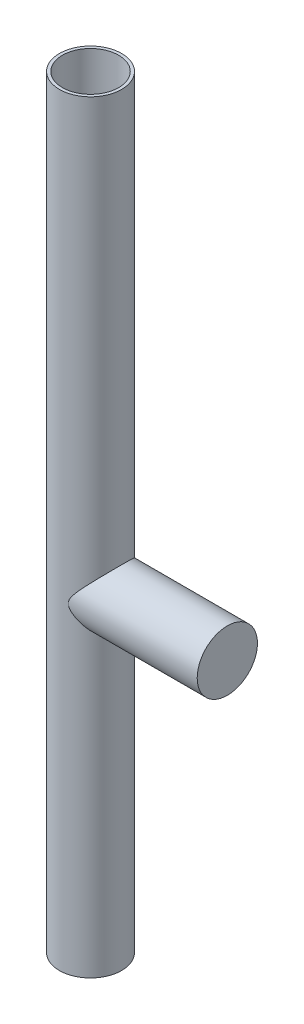
ISO-10303-21;
HEADER;
FILE_DESCRIPTION(('STEP AP214'),'2;1');
FILE_NAME('part.step','',(''),(''),'','','');
FILE_SCHEMA(('AUTOMOTIVE_DESIGN { 1 0 10303 214 1 1 1 1 }'));
ENDSEC;
DATA;
#1=APPLICATION_CONTEXT('core data for automotive mechanical design processes');
#2=APPLICATION_PROTOCOL_DEFINITION('international standard','automotive_design',2000,#1);
#3=PRODUCT_CONTEXT('',#1,'mechanical');
#4=PRODUCT('Part','Part','',(#3));
#5=PRODUCT_RELATED_PRODUCT_CATEGORY('part','',(#4));
#6=PRODUCT_DEFINITION_FORMATION('','',#4);
#7=PRODUCT_DEFINITION_CONTEXT('part definition',#1,'design');
#8=PRODUCT_DEFINITION('design','',#6,#7);
#9=PRODUCT_DEFINITION_SHAPE('','',#8);
#10=(LENGTH_UNIT() NAMED_UNIT(*) SI_UNIT(.MILLI.,.METRE.));
#11=(NAMED_UNIT(*) PLANE_ANGLE_UNIT() SI_UNIT($,.RADIAN.));
#12=(NAMED_UNIT(*) SI_UNIT($,.STERADIAN.) SOLID_ANGLE_UNIT());
#13=UNCERTAINTY_MEASURE_WITH_UNIT(LENGTH_MEASURE(1.E-05),#10,'distance_accuracy_value','');
#14=(GEOMETRIC_REPRESENTATION_CONTEXT(3) GLOBAL_UNCERTAINTY_ASSIGNED_CONTEXT((#13)) GLOBAL_UNIT_ASSIGNED_CONTEXT((#10,
#11,#12)) REPRESENTATION_CONTEXT('',''));
#15=CARTESIAN_POINT('',(0.,0.,0.));
#16=DIRECTION('',(0.,0.,1.));
#17=DIRECTION('',(1.,0.,0.));
#18=AXIS2_PLACEMENT_3D('',#15,#16,#17);
#19=CARTESIAN_POINT('',(72.0622031998294,75.,0.));
#20=DIRECTION('',(-1.,0.,0.));
#21=DIRECTION('',(0.,0.,1.));
#22=AXIS2_PLACEMENT_3D('',#19,#20,#21);
#23=CYLINDRICAL_SURFACE('',#22,7.5);
#24=CARTESIAN_POINT('',(1.95256241897666,75.,7.5));
#25=CARTESIAN_POINT('',(1.95254027287941,75.1301890502717,7.50000356990272));
#26=CARTESIAN_POINT('',(1.96590520223219,75.2603568940081,7.49656241617327));
#27=CARTESIAN_POINT('',(2.01569819316504,75.5162819695374,7.48331854549107));
#28=CARTESIAN_POINT('',(2.05225463976761,75.6420105092941,7.47348040811489));
#29=CARTESIAN_POINT('',(2.13363712639972,75.865327485485,7.45060684486488));
#30=CARTESIAN_POINT('',(2.17590108832877,75.9639934948249,7.43843077396391));
#31=CARTESIAN_POINT('',(2.2681474237054,76.1572248140775,7.4108262060249));
#32=CARTESIAN_POINT('',(2.31813693956844,76.2517862245286,7.39539469440364));
#33=CARTESIAN_POINT('',(2.47617651022723,76.5305882452537,7.34460192400622));
#34=CARTESIAN_POINT('',(2.59210402189804,76.709487952865,7.30479296654339));
#35=CARTESIAN_POINT('',(2.85729149296307,77.0913591856681,7.20571259971662));
#36=CARTESIAN_POINT('',(3.00864163713575,77.2922162919602,7.14415925232692));
#37=CARTESIAN_POINT('',(3.3171934453091,77.6843476964629,7.00624041361422));
#38=CARTESIAN_POINT('',(3.47440032136982,77.8756130856665,6.92986146123077));
#39=CARTESIAN_POINT('',(3.79048844505221,78.2504467138194,6.76215779582004));
#40=CARTESIAN_POINT('',(3.94937144041231,78.4340056608059,6.67081565643868));
#41=CARTESIAN_POINT('',(4.26590173295146,78.7937680865314,6.47297704973329));
#42=CARTESIAN_POINT('',(4.42354936760267,78.969973635296,6.36648488496098));
#43=CARTESIAN_POINT('',(4.77008079089776,79.3530728523875,6.11265712391416));
#44=CARTESIAN_POINT('',(4.95818344072453,79.5581613734927,5.96149384180011));
#45=CARTESIAN_POINT('',(5.32639528655411,79.9561730500059,5.63494701276092));
#46=CARTESIAN_POINT('',(5.5065008896944,80.1490907534428,5.45955272210076));
#47=CARTESIAN_POINT('',(5.8547129489229,80.5198913908207,5.08429956510327));
#48=CARTESIAN_POINT('',(6.02285659504625,80.6978212711934,4.88452228632779));
#49=CARTESIAN_POINT('',(6.34382195995667,81.0360927605903,4.45974127182885));
#50=CARTESIAN_POINT('',(6.49665810123219,81.1964509390558,4.23476171295629));
#51=CARTESIAN_POINT('',(6.80364239113859,81.5176370856967,3.72473278881411));
#52=CARTESIAN_POINT('',(6.95478060459687,81.6751757748202,3.43570192792498));
#53=CARTESIAN_POINT('',(7.15644612432528,81.8849534856609,2.97918511429341));
#54=CARTESIAN_POINT('',(7.21950433346244,81.9504680102473,2.82315125802899));
#55=CARTESIAN_POINT('',(7.33630454717285,82.071713423744,2.50398942637429));
#56=CARTESIAN_POINT('',(7.3900510089274,82.1274489936331,2.34086489205796));
#57=CARTESIAN_POINT('',(7.48772711238075,82.2286745024491,2.00674606041653));
#58=CARTESIAN_POINT('',(7.53155773015203,82.2740611249008,1.83569132156844));
#59=CARTESIAN_POINT('',(7.6078174013041,82.3529918718908,1.48836051755561));
#60=CARTESIAN_POINT('',(7.64024647712757,82.3865360197397,1.3120844626692));
#61=CARTESIAN_POINT('',(7.69292481367634,82.4410107036105,0.955923074061227));
#62=CARTESIAN_POINT('',(7.7131830076892,82.4619504911098,0.77604048795549));
#63=CARTESIAN_POINT('',(7.74104528569166,82.490747330483,0.414265296344475));
#64=CARTESIAN_POINT('',(7.74865113994895,82.4986062125879,0.232372975619271));
#65=CARTESIAN_POINT('',(7.75086572435814,82.500894551507,-0.107713351385544));
#66=CARTESIAN_POINT('',(7.7470465594858,82.4969484027336,-0.265890370151748));
#67=CARTESIAN_POINT('',(7.72979138508297,82.4791162593342,-0.581155813814566));
#68=CARTESIAN_POINT('',(7.71635553573556,82.4652304302714,-0.738244256799352));
#69=CARTESIAN_POINT('',(7.6801250963743,82.4277751714667,-1.05015842492861));
#70=CARTESIAN_POINT('',(7.65733066802929,82.4042059090055,-1.20498418911287));
#71=CARTESIAN_POINT('',(7.60280151254774,82.347798502893,-1.51133056285157));
#72=CARTESIAN_POINT('',(7.57106646918115,82.3149600313892,-1.66285105529409));
#73=CARTESIAN_POINT('',(7.4999180044693,82.2412954292593,-1.95867303867399));
#74=CARTESIAN_POINT('',(7.46067229268881,82.2006436923805,-2.10305848479811));
#75=CARTESIAN_POINT('',(7.37470118482368,82.1115296651748,-2.38711899506823));
#76=CARTESIAN_POINT('',(7.32797365392898,82.0630651455759,-2.52679270098651));
#77=CARTESIAN_POINT('',(7.17748500075082,81.9068501535315,-2.9378934273682));
#78=CARTESIAN_POINT('',(7.06337770699466,81.7882367916999,-3.20156266232297));
#79=CARTESIAN_POINT('',(6.84637738953641,81.5620960088776,-3.6376074580444));
#80=CARTESIAN_POINT('',(6.74863418835963,81.4600743884691,-3.81555231105567));
#81=CARTESIAN_POINT('',(6.5429539975206,81.2448977289165,-4.15838545438968));
#82=CARTESIAN_POINT('',(6.43501588370935,81.1317414619453,-4.32327230116854));
#83=CARTESIAN_POINT('',(6.21036735788039,80.8955490620631,-4.64022495347486));
#84=CARTESIAN_POINT('',(6.09363518929716,80.7724883705079,-4.79225684512036));
#85=CARTESIAN_POINT('',(5.85316182217974,80.5180368091598,-5.08316928074444));
#86=CARTESIAN_POINT('',(5.72942075057901,80.386646090221,-5.22205006277217));
#87=CARTESIAN_POINT('',(5.43005788870909,80.0672657820773,-5.53529654472826));
#88=CARTESIAN_POINT('',(5.25198337696498,79.8761204328712,-5.70411469850548));
#89=CARTESIAN_POINT('',(4.88838841507936,79.4821454384826,-6.01863497610819));
#90=CARTESIAN_POINT('',(4.70286412060642,79.2793097365728,-6.164324967878));
#91=CARTESIAN_POINT('',(4.32780783607666,78.8633578794395,-6.43317336208854));
#92=CARTESIAN_POINT('',(4.13828151045811,78.6502557705075,-6.55636150349144));
#93=CARTESIAN_POINT('',(3.75872251288581,78.2136113870479,-6.78107931429117));
#94=CARTESIAN_POINT('',(3.56869020835096,77.9900753859155,-6.88262179881014));
#95=CARTESIAN_POINT('',(3.23422142691717,77.5804176578913,-7.04477821649563));
#96=CARTESIAN_POINT('',(3.08883901014458,77.3967029966683,-7.1094921177642));
#97=CARTESIAN_POINT('',(2.87670542265433,77.1134788910826,-7.19673195269228));
#98=CARTESIAN_POINT('',(2.80694578179858,77.0177381712533,-7.22418636545723));
#99=CARTESIAN_POINT('',(2.67053132359378,76.8231934127341,-7.27571861977974));
#100=CARTESIAN_POINT('',(2.60387604686119,76.7243898309137,-7.29979696199499));
#101=CARTESIAN_POINT('',(2.44170603015909,76.4708645470277,-7.35603077462036));
#102=CARTESIAN_POINT('',(2.34914032570697,76.3137036848471,-7.38590393395599));
#103=CARTESIAN_POINT('',(2.18375261076396,75.987843446622,-7.43647380921712));
#104=CARTESIAN_POINT('',(2.11085988094345,75.8191882054588,-7.45720356858238));
#105=CARTESIAN_POINT('',(2.02171618008148,75.5343924563744,-7.4817448089777));
#106=CARTESIAN_POINT('',(1.99447925788354,75.4221309836867,-7.48898274066381));
#107=CARTESIAN_POINT('',(1.95903966691131,75.1945637818613,-7.49833482995199));
#108=CARTESIAN_POINT('',(1.95078343428337,75.0792675505072,-7.50046340699817));
#109=CARTESIAN_POINT('',(1.95500219863361,74.8488888492252,-7.49936454467398));
#110=CARTESIAN_POINT('',(1.96751716142526,74.7338072189072,-7.49612677995322));
#111=CARTESIAN_POINT('',(2.01067644785891,74.5072296445273,-7.48466009422864));
#112=CARTESIAN_POINT('',(2.04137116110638,74.3957445783591,-7.47641729895754));
#113=CARTESIAN_POINT('',(2.11124425163456,74.192030006266,-7.45696184233885));
#114=CARTESIAN_POINT('',(2.14881562505552,74.0991728124093,-7.44627002769129));
#115=CARTESIAN_POINT('',(2.23126745170366,73.9171115507853,-7.42198045069847));
#116=CARTESIAN_POINT('',(2.27615471921823,73.8279109868178,-7.40837997539909));
#117=CARTESIAN_POINT('',(2.37129101172992,73.6524160318184,-7.37848068654962));
#118=CARTESIAN_POINT('',(2.42156263489764,73.5661360623893,-7.36217032827195));
#119=CARTESIAN_POINT('',(2.5257751687595,73.3964058989416,-7.32707228926546));
#120=CARTESIAN_POINT('',(2.57971490246393,73.3129548099765,-7.30828540138392));
#121=CARTESIAN_POINT('',(2.71840224747815,73.1063971949827,-7.25814312053561));
#122=CARTESIAN_POINT('',(2.80482384387862,72.9847876231463,-7.22526652273103));
#123=CARTESIAN_POINT('',(2.98123783204384,72.7457264959351,-7.15428459342945));
#124=CARTESIAN_POINT('',(3.07123161782724,72.6282765983539,-7.1161772061114));
#125=CARTESIAN_POINT('',(3.25340740517797,72.3966798065256,-7.03475708264581));
#126=CARTESIAN_POINT('',(3.34559201782877,72.2825372546658,-6.99143785657831));
#127=CARTESIAN_POINT('',(3.53104345280444,72.0572405424322,-6.89963426250104));
#128=CARTESIAN_POINT('',(3.62431040768229,71.9460867537373,-6.85114925576766));
#129=CARTESIAN_POINT('',(3.90469664444104,71.6165678565567,-6.69784878168772));
#130=CARTESIAN_POINT('',(4.0923402536245,71.4022210232242,-6.58521463103373));
#131=CARTESIAN_POINT('',(4.46468347287635,70.9838013499097,-6.33869131205799));
#132=CARTESIAN_POINT('',(4.64938534354837,70.7797203320953,-6.20481942670768));
#133=CARTESIAN_POINT('',(4.98367927569591,70.4142527778987,-5.93830512381304));
#134=CARTESIAN_POINT('',(5.13413680618987,70.2512819918157,-5.80893408684942));
#135=CARTESIAN_POINT('',(5.42917193428811,69.9337553727086,-5.53419195861925));
#136=CARTESIAN_POINT('',(5.57374849376934,69.7792010237571,-5.38881805913076));
#137=CARTESIAN_POINT('',(5.99534743655019,69.3305888588968,-4.92858519858198));
#138=CARTESIAN_POINT('',(6.2612522124272,69.0504853290095,-4.58883251688156));
#139=CARTESIAN_POINT('',(6.68056512454135,68.6109114307562,-3.94191283325759));
#140=CARTESIAN_POINT('',(6.8450451348759,68.4392087911171,-3.65030961219098));
#141=CARTESIAN_POINT('',(7.06626080229294,68.2088291137177,-3.18743418734476));
#142=CARTESIAN_POINT('',(7.13574572732094,68.1365679404697,-3.02890605250445));
#143=CARTESIAN_POINT('',(7.26514755941465,68.0021288215223,-2.7038308639568));
#144=CARTESIAN_POINT('',(7.32506582139295,67.9399494479329,-2.53728495015218));
#145=CARTESIAN_POINT('',(7.42607041884569,67.8352122238539,-2.22240882282034));
#146=CARTESIAN_POINT('',(7.46863250494605,67.7911111671621,-2.0750632112109));
#147=CARTESIAN_POINT('',(7.54536227034881,67.7116463670265,-1.77590561385838));
#148=CARTESIAN_POINT('',(7.57953144814348,67.6762810638716,-1.62409443083812));
#149=CARTESIAN_POINT('',(7.63889095729658,67.6148651229367,-1.31692911782155));
#150=CARTESIAN_POINT('',(7.66408486499287,67.5888107750468,-1.16157642530945));
#151=CARTESIAN_POINT('',(7.70505181339951,67.5464536995863,-0.848308586543059));
#152=CARTESIAN_POINT('',(7.72082474811813,67.5301510817287,-0.6903934114798));
#153=CARTESIAN_POINT('',(7.74267536431238,67.5075684862173,-0.372698536172449));
#154=CARTESIAN_POINT('',(7.74872388511626,67.5013186538993,-0.212914669877019));
#155=CARTESIAN_POINT('',(7.75091283288039,67.4990567378023,0.106793936134085));
#156=CARTESIAN_POINT('',(7.7470532490232,67.5030446652005,0.266718676003372));
#157=CARTESIAN_POINT('',(7.72950286697246,67.5211819253413,0.585461348422942));
#158=CARTESIAN_POINT('',(7.71581102520552,67.5353323367069,0.744279161679741));
#159=CARTESIAN_POINT('',(7.67886574858892,67.5735269088175,1.05958530949372));
#160=CARTESIAN_POINT('',(7.65561238406324,67.5975709967957,1.21607366117507));
#161=CARTESIAN_POINT('',(7.60120639027559,67.6538521494461,1.51879920424658));
#162=CARTESIAN_POINT('',(7.57044825176574,67.6856801996299,1.66518380575865));
#163=CARTESIAN_POINT('',(7.50108421931344,67.7574969661752,1.95405768952563));
#164=CARTESIAN_POINT('',(7.46247536655688,67.7974887593488,2.09654548009397));
#165=CARTESIAN_POINT('',(7.33568823909152,67.9289067374357,2.517084366705));
#166=CARTESIAN_POINT('',(7.2365140742332,68.031811992587,2.78840196165883));
#167=CARTESIAN_POINT('',(7.04767030891197,68.2281728172955,3.2298441746521));
#168=CARTESIAN_POINT('',(6.96422111951203,68.3150490189622,3.40572684810952));
#169=CARTESIAN_POINT('',(6.7871010108309,68.4997752018249,3.74627564451735));
#170=CARTESIAN_POINT('',(6.69342684066661,68.5976286733591,3.91093817300184));
#171=CARTESIAN_POINT('',(6.39895314391098,68.9059159182756,4.38813382240221));
#172=CARTESIAN_POINT('',(6.18492207997442,69.1308489170234,4.68337854030551));
#173=CARTESIAN_POINT('',(5.80429472867883,69.5337220845628,5.14113393117714));
#174=CARTESIAN_POINT('',(5.64409298887496,69.7040384546007,5.31609945829633));
#175=CARTESIAN_POINT('',(5.31495938398476,70.0562921696452,5.64515827224314));
#176=CARTESIAN_POINT('',(5.14602359860733,70.2382347418915,5.79924207191395));
#177=CARTESIAN_POINT('',(4.80226359823655,70.611988315471,6.0869508369384));
#178=CARTESIAN_POINT('',(4.62744405222879,70.8037915529146,6.22059157844494));
#179=CARTESIAN_POINT('',(4.27447335653798,71.1965751083213,6.46821713069223));
#180=CARTESIAN_POINT('',(4.09632352718351,71.3975518330758,6.58220955541836));
#181=CARTESIAN_POINT('',(3.73491438100616,71.8143477918852,6.79395342805739));
#182=CARTESIAN_POINT('',(3.55164483015955,72.0304192761152,6.89119412185364));
#183=CARTESIAN_POINT('',(3.2802809454079,72.3633760397362,7.02227970135439));
#184=CARTESIAN_POINT('',(3.19036253278028,72.4759080204377,7.06353299924593));
#185=CARTESIAN_POINT('',(3.0127964347602,72.7044258960287,7.14107255141409));
#186=CARTESIAN_POINT('',(2.92514844291636,72.8204113201971,7.17735947889158));
#187=CARTESIAN_POINT('',(2.77048898723196,73.0334402954281,7.23825835964615));
#188=CARTESIAN_POINT('',(2.70280222510427,73.1297361663225,7.26376416720267));
#189=CARTESIAN_POINT('',(2.5711370244475,73.3256291305036,7.31140529448361));
#190=CARTESIAN_POINT('',(2.50715764099913,73.4252253723442,7.33354147540362));
#191=CARTESIAN_POINT('',(2.3847968889834,73.6283837653794,7.3742381293891));
#192=CARTESIAN_POINT('',(2.32640834468138,73.7319405875643,7.39280321763623));
#193=CARTESIAN_POINT('',(2.21801632314516,73.943883092654,7.42604304105235));
#194=CARTESIAN_POINT('',(2.16800416460252,74.0522636268904,7.44072181329136));
#195=CARTESIAN_POINT('',(2.07177383643325,74.296639772884,7.46814667247941));
#196=CARTESIAN_POINT('',(2.02824367384823,74.4338696270216,7.47994246052326));
#197=CARTESIAN_POINT('',(1.96874742834689,74.7141070116345,7.49583999418336));
#198=CARTESIAN_POINT('',(1.9525867330331,74.8570662866797,7.49999608062697));
#199=CARTESIAN_POINT('',(1.95256241897666,75.,7.5));
#200=B_SPLINE_CURVE_WITH_KNOTS('',3,(#24,#25,#26,#27,#28,#29,#30,#31,#32,#33,#34,#35,#36,#37,
#38,#39,#40,#41,#42,#43,#44,#45,#46,#47,#48,#49,#50,#51,#52,#53,#54,#55,#56,#57,#58,#59,#60,#61,
#62,#63,#64,#65,#66,#67,#68,#69,#70,#71,#72,#73,#74,#75,#76,#77,#78,#79,#80,#81,#82,#83,#84,#85,
#86,#87,#88,#89,#90,#91,#92,#93,#94,#95,#96,#97,#98,#99,#100,#101,#102,#103,#104,#105,#106,#107,
#108,#109,#110,#111,#112,#113,#114,#115,#116,#117,#118,#119,#120,#121,#122,#123,#124,#125,#126,
#127,#128,#129,#130,#131,#132,#133,#134,#135,#136,#137,#138,#139,#140,#141,#142,#143,#144,#145,
#146,#147,#148,#149,#150,#151,#152,#153,#154,#155,#156,#157,#158,#159,#160,#161,#162,#163,#164,
#165,#166,#167,#168,#169,#170,#171,#172,#173,#174,#175,#176,#177,#178,#179,#180,#181,#182,#183,
#184,#185,#186,#187,#188,#189,#190,#191,#192,#193,#194,#195,#196,#197,#198,#199),.UNSPECIFIED.,
.T.,.F.,(4,2,2,2,2,2,2,2,2,2,2,2,2,2,2,2,2,2,2,2,2,2,2,2,2,2,2,2,2,2,2,2,2,2,2,2,2,2,2,2,2,2,2,
2,2,2,2,2,2,2,2,2,2,2,2,2,2,2,2,2,2,2,2,2,2,2,2,2,2,2,2,2,2,2,2,2,2,2,2,2,2,2,2,2,2,2,2,4),(0.,
0.389965564005651,0.782108988864908,1.1057137636422,1.42961952673076,2.07891859918032,
2.8549128169626,3.63161493055298,4.4092281193448,5.18662090806519,6.13550681260253,
7.08481480004491,8.03102919172628,8.97634351877103,10.0584379073188,10.5996994453947,
11.1407011819244,11.6868880161218,12.2330737752045,12.7788581488699,13.3245661520178,
13.7987861199812,14.2729981891474,14.7472020666762,15.2214227189288,15.6860822606644,
16.1508746221569,17.0799467438483,17.7607803274752,18.4416890715191,19.124341510672,
19.8069815907228,20.7387557636887,21.6710171023497,22.6020372847638,23.5325047244496,
24.2610626590175,24.6257618322243,24.9904068646771,25.5440561389555,26.095687843728,
26.441544400224,26.786423738741,27.131967428461,27.4784733885602,27.7802416308171,
28.0822925743102,28.3856649695257,28.6889404765525,29.1469904800454,29.6052210259879,
30.0640281962207,30.5228921617043,31.4409221238513,32.3582088025692,33.1278291547124,
33.8975847776859,35.4320894342603,36.556432885814,37.1185470293559,37.6805814907327,
38.1588503617203,38.6370337791346,39.1150264431436,39.5930244847623,40.0724532469814,
40.5518825326298,41.0313627113298,41.5108393635676,41.9691272636757,42.427588206689,
43.3439233557735,43.982695665884,44.621671659125,45.9013675912406,46.7765099119065,
47.6520485108973,48.526908000108,49.4014277036395,50.2991346216391,50.7485376087935,
51.1978796180658,51.5590728734699,51.9201736610047,52.280804589343,52.6410594144758,
53.0722793711016,53.5004200328087),.UNSPECIFIED.);
#201=CARTESIAN_POINT('',(1.95256241897666,75.,7.5));
#202=VERTEX_POINT('',#201);
#203=EDGE_CURVE('E44',#202,#202,#200,.T.);
#204=ORIENTED_EDGE('',*,*,#203,.F.);
#205=EDGE_LOOP('',(#204));
#206=FACE_BOUND('',#205,.T.);
#207=CARTESIAN_POINT('',(34.0622031998294,75.,0.));
#208=DIRECTION('',(1.,0.,0.));
#209=DIRECTION('',(0.,0.,-1.));
#210=AXIS2_PLACEMENT_3D('',#207,#208,#209);
#211=CIRCLE('',#210,7.50000000000001);
#212=CARTESIAN_POINT('',(34.0622031998294,75.,-7.50000000000001));
#213=VERTEX_POINT('',#212);
#214=EDGE_CURVE('E86',#213,#213,#211,.T.);
#215=ORIENTED_EDGE('',*,*,#214,.F.);
#216=EDGE_LOOP('',(#215));
#217=FACE_BOUND('',#216,.T.);
#218=ADVANCED_FACE('F32',(#206,#217),#23,.T.);
#219=CARTESIAN_POINT('',(0.,-5.,0.));
#220=DIRECTION('',(0.,1.,0.));
#221=DIRECTION('',(0.,0.,1.));
#222=AXIS2_PLACEMENT_3D('',#219,#220,#221);
#223=CYLINDRICAL_SURFACE('',#222,7.75);
#224=CARTESIAN_POINT('',(0.,-5.,0.));
#225=DIRECTION('',(0.,1.,0.));
#226=DIRECTION('',(0.,0.,1.));
#227=AXIS2_PLACEMENT_3D('',#224,#225,#226);
#228=CIRCLE('',#227,7.75);
#229=CARTESIAN_POINT('',(0.,-5.,7.75));
#230=VERTEX_POINT('',#229);
#231=EDGE_CURVE('E10',#230,#230,#228,.T.);
#232=ORIENTED_EDGE('',*,*,#231,.T.);
#233=EDGE_LOOP('',(#232));
#234=FACE_BOUND('',#233,.T.);
#235=ORIENTED_EDGE('',*,*,#203,.T.);
#236=EDGE_LOOP('',(#235));
#237=FACE_BOUND('',#236,.T.);
#238=CARTESIAN_POINT('',(0.,185.,0.));
#239=DIRECTION('',(0.,1.,0.));
#240=DIRECTION('',(0.,0.,1.));
#241=AXIS2_PLACEMENT_3D('',#238,#239,#240);
#242=CIRCLE('',#241,7.75);
#243=CARTESIAN_POINT('',(0.,185.,7.75));
#244=VERTEX_POINT('',#243);
#245=EDGE_CURVE('E48',#244,#244,#242,.T.);
#246=ORIENTED_EDGE('',*,*,#245,.F.);
#247=EDGE_LOOP('',(#246));
#248=FACE_BOUND('',#247,.T.);
#249=ADVANCED_FACE('F34',(#234,#237,#248),#223,.T.);
#250=CARTESIAN_POINT('',(0.,-5.,0.));
#251=DIRECTION('',(0.,1.,0.));
#252=DIRECTION('',(0.,0.,1.));
#253=AXIS2_PLACEMENT_3D('',#250,#251,#252);
#254=CYLINDRICAL_SURFACE('',#253,7.);
#255=CARTESIAN_POINT('',(0.,-5.,0.));
#256=DIRECTION('',(0.,1.,0.));
#257=DIRECTION('',(0.,0.,1.));
#258=AXIS2_PLACEMENT_3D('',#255,#256,#257);
#259=CIRCLE('',#258,7.);
#260=CARTESIAN_POINT('',(0.,-5.,7.));
#261=VERTEX_POINT('',#260);
#262=EDGE_CURVE('E40',#261,#261,#259,.T.);
#263=ORIENTED_EDGE('',*,*,#262,.F.);
#264=EDGE_LOOP('',(#263));
#265=FACE_BOUND('',#264,.T.);
#266=CARTESIAN_POINT('',(0.,185.,0.));
#267=DIRECTION('',(0.,1.,0.));
#268=DIRECTION('',(0.,0.,1.));
#269=AXIS2_PLACEMENT_3D('',#266,#267,#268);
#270=CIRCLE('',#269,7.);
#271=CARTESIAN_POINT('',(0.,185.,7.));
#272=VERTEX_POINT('',#271);
#273=EDGE_CURVE('E84',#272,#272,#270,.T.);
#274=ORIENTED_EDGE('',*,*,#273,.T.);
#275=EDGE_LOOP('',(#274));
#276=FACE_BOUND('',#275,.T.);
#277=ADVANCED_FACE('F62',(#265,#276),#254,.F.);
#278=CARTESIAN_POINT('',(0.,-5.,0.));
#279=DIRECTION('',(0.,1.,0.));
#280=DIRECTION('',(0.,0.,1.));
#281=AXIS2_PLACEMENT_3D('',#278,#279,#280);
#282=PLANE('',#281);
#283=ORIENTED_EDGE('',*,*,#262,.T.);
#284=EDGE_LOOP('',(#283));
#285=FACE_BOUND('',#284,.T.);
#286=ORIENTED_EDGE('',*,*,#231,.F.);
#287=EDGE_LOOP('',(#286));
#288=FACE_BOUND('',#287,.T.);
#289=ADVANCED_FACE('F64',(#285,#288),#282,.F.);
#290=CARTESIAN_POINT('',(0.,185.,0.));
#291=DIRECTION('',(0.,1.,0.));
#292=DIRECTION('',(0.,0.,1.));
#293=AXIS2_PLACEMENT_3D('',#290,#291,#292);
#294=PLANE('',#293);
#295=ORIENTED_EDGE('',*,*,#245,.T.);
#296=EDGE_LOOP('',(#295));
#297=FACE_BOUND('',#296,.T.);
#298=ORIENTED_EDGE('',*,*,#273,.F.);
#299=EDGE_LOOP('',(#298));
#300=FACE_BOUND('',#299,.T.);
#301=ADVANCED_FACE('F60',(#297,#300),#294,.T.);
#302=CARTESIAN_POINT('',(34.0622031998294,75.,0.));
#303=DIRECTION('',(1.,0.,0.));
#304=DIRECTION('',(0.,0.,-1.));
#305=AXIS2_PLACEMENT_3D('',#302,#303,#304);
#306=PLANE('',#305);
#307=ORIENTED_EDGE('',*,*,#214,.T.);
#308=EDGE_LOOP('',(#307));
#309=FACE_BOUND('',#308,.T.);
#310=ADVANCED_FACE('F71',(#309),#306,.T.);
#311=CLOSED_SHELL('',(#218,#249,#277,#289,#301,#310));
#312=MANIFOLD_SOLID_BREP('B2',#311);
#313=ADVANCED_BREP_SHAPE_REPRESENTATION('',(#18,#312),#14);
#314=SHAPE_DEFINITION_REPRESENTATION(#9,#313);
ENDSEC;
END-ISO-10303-21;
